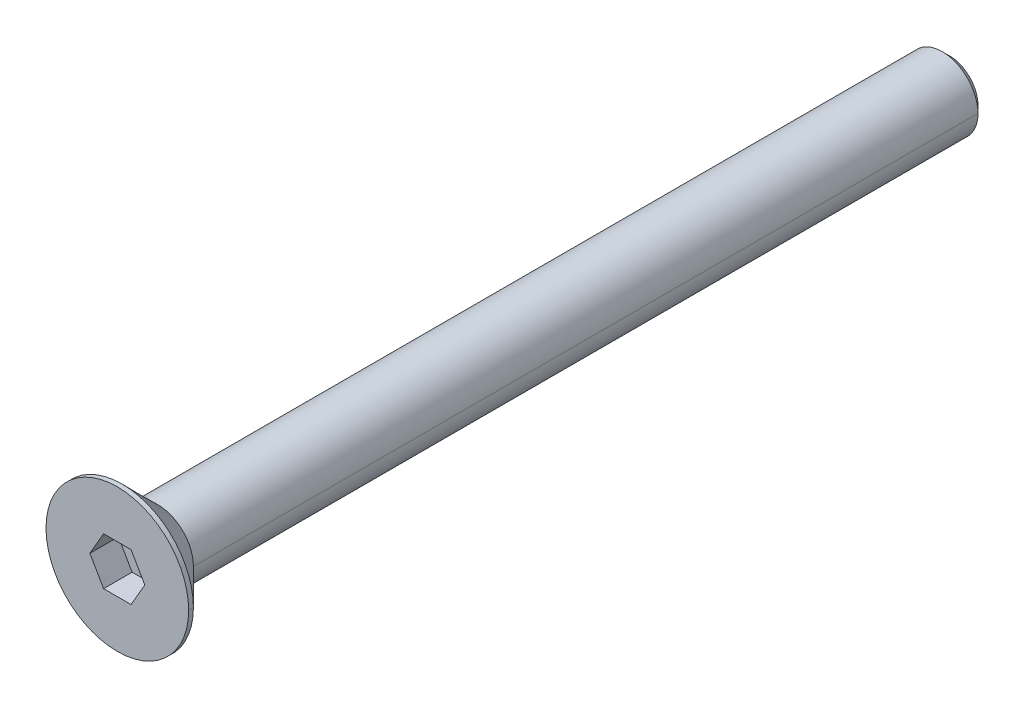
ISO-10303-21;
HEADER;
FILE_DESCRIPTION(('STEP AP214'),'2;1');
FILE_NAME('part.step','',(''),(''),'','','');
FILE_SCHEMA(('AUTOMOTIVE_DESIGN { 1 0 10303 214 1 1 1 1 }'));
ENDSEC;
DATA;
#1=APPLICATION_CONTEXT('core data for automotive mechanical design processes');
#2=APPLICATION_PROTOCOL_DEFINITION('international standard','automotive_design',2000,#1);
#3=PRODUCT_CONTEXT('',#1,'mechanical');
#4=PRODUCT('Part','Part','',(#3));
#5=PRODUCT_RELATED_PRODUCT_CATEGORY('part','',(#4));
#6=PRODUCT_DEFINITION_FORMATION('','',#4);
#7=PRODUCT_DEFINITION_CONTEXT('part definition',#1,'design');
#8=PRODUCT_DEFINITION('design','',#6,#7);
#9=PRODUCT_DEFINITION_SHAPE('','',#8);
#10=(LENGTH_UNIT() NAMED_UNIT(*) SI_UNIT(.MILLI.,.METRE.));
#11=(NAMED_UNIT(*) PLANE_ANGLE_UNIT() SI_UNIT($,.RADIAN.));
#12=(NAMED_UNIT(*) SI_UNIT($,.STERADIAN.) SOLID_ANGLE_UNIT());
#13=UNCERTAINTY_MEASURE_WITH_UNIT(LENGTH_MEASURE(1.E-05),#10,'distance_accuracy_value','');
#14=(GEOMETRIC_REPRESENTATION_CONTEXT(3) GLOBAL_UNCERTAINTY_ASSIGNED_CONTEXT((#13)) GLOBAL_UNIT_ASSIGNED_CONTEXT((#10,
#11,#12)) REPRESENTATION_CONTEXT('',''));
#15=CARTESIAN_POINT('',(0.,0.,0.));
#16=DIRECTION('',(0.,0.,1.));
#17=DIRECTION('',(1.,0.,0.));
#18=AXIS2_PLACEMENT_3D('',#15,#16,#17);
#19=CARTESIAN_POINT('',(0.,0.,1.7));
#20=DIRECTION('',(0.,0.,1.));
#21=DIRECTION('',(1.,0.,0.));
#22=AXIS2_PLACEMENT_3D('',#19,#20,#21);
#23=PLANE('',#22);
#24=DIRECTION('',(0.50000000000019,0.866025403784329,0.));
#25=VECTOR('',#24,1.);
#26=CARTESIAN_POINT('',(0.5775,-1.000259341371,1.7));
#27=LINE('',#26,#25);
#28=CARTESIAN_POINT('',(0.5775,-1.000259341371,1.7));
#29=VERTEX_POINT('',#28);
#30=CARTESIAN_POINT('',(1.155,0.,1.7));
#31=VERTEX_POINT('',#30);
#32=EDGE_CURVE('E28',#29,#31,#27,.T.);
#33=ORIENTED_EDGE('',*,*,#32,.F.);
#34=DIRECTION('',(1.,0.,0.));
#35=VECTOR('',#34,1.);
#36=CARTESIAN_POINT('',(-0.5775,-1.000259341371,1.7));
#37=LINE('',#36,#35);
#38=CARTESIAN_POINT('',(-0.5775,-1.000259341371,1.7));
#39=VERTEX_POINT('',#38);
#40=EDGE_CURVE('E163',#39,#29,#37,.T.);
#41=ORIENTED_EDGE('',*,*,#40,.F.);
#42=DIRECTION('',(0.50000000000019,-0.866025403784329,0.));
#43=VECTOR('',#42,1.);
#44=CARTESIAN_POINT('',(-1.155,0.,1.7));
#45=LINE('',#44,#43);
#46=CARTESIAN_POINT('',(-1.155,0.,1.7));
#47=VERTEX_POINT('',#46);
#48=EDGE_CURVE('E164',#47,#39,#45,.T.);
#49=ORIENTED_EDGE('',*,*,#48,.F.);
#50=DIRECTION('',(-0.50000000000019,-0.866025403784329,0.));
#51=VECTOR('',#50,1.);
#52=CARTESIAN_POINT('',(-0.5775,1.000259341371,1.7));
#53=LINE('',#52,#51);
#54=CARTESIAN_POINT('',(-0.5775,1.000259341371,1.7));
#55=VERTEX_POINT('',#54);
#56=EDGE_CURVE('E207',#55,#47,#53,.T.);
#57=ORIENTED_EDGE('',*,*,#56,.F.);
#58=DIRECTION('',(-1.,0.,0.));
#59=VECTOR('',#58,1.);
#60=CARTESIAN_POINT('',(0.5775,1.000259341371,1.7));
#61=LINE('',#60,#59);
#62=CARTESIAN_POINT('',(0.5775,1.000259341371,1.7));
#63=VERTEX_POINT('',#62);
#64=EDGE_CURVE('E187',#63,#55,#61,.T.);
#65=ORIENTED_EDGE('',*,*,#64,.F.);
#66=DIRECTION('',(-0.50000000000019,0.866025403784329,0.));
#67=VECTOR('',#66,1.);
#68=CARTESIAN_POINT('',(1.155,0.,1.7));
#69=LINE('',#68,#67);
#70=EDGE_CURVE('E188',#31,#63,#69,.T.);
#71=ORIENTED_EDGE('',*,*,#70,.F.);
#72=EDGE_LOOP('',(#33,#41,#49,#57,#65,#71));
#73=FACE_BOUND('',#72,.T.);
#74=CARTESIAN_POINT('',(0.,0.,1.7));
#75=DIRECTION('',(0.,0.,1.));
#76=DIRECTION('',(1.,0.,0.));
#77=AXIS2_PLACEMENT_3D('',#74,#75,#76);
#78=CIRCLE('',#77,3.);
#79=CARTESIAN_POINT('',(3.,0.,1.7));
#80=VERTEX_POINT('',#79);
#81=CARTESIAN_POINT('',(-3.,0.,1.7));
#82=VERTEX_POINT('',#81);
#83=EDGE_CURVE('E11',#80,#82,#78,.T.);
#84=ORIENTED_EDGE('',*,*,#83,.T.);
#85=CARTESIAN_POINT('',(0.,0.,1.7));
#86=DIRECTION('',(0.,0.,1.));
#87=DIRECTION('',(1.,0.,0.));
#88=AXIS2_PLACEMENT_3D('',#85,#86,#87);
#89=CIRCLE('',#88,3.);
#90=EDGE_CURVE('E151',#82,#80,#89,.T.);
#91=ORIENTED_EDGE('',*,*,#90,.T.);
#92=EDGE_LOOP('',(#84,#91));
#93=FACE_BOUND('',#92,.T.);
#94=ADVANCED_FACE('F17',(#73,#93),#23,.T.);
#95=CARTESIAN_POINT('',(0.,0.,1.7));
#96=DIRECTION('',(0.,0.,-1.));
#97=DIRECTION('',(1.,0.,0.));
#98=AXIS2_PLACEMENT_3D('',#95,#96,#97);
#99=CYLINDRICAL_SURFACE('',#98,3.);
#100=DIRECTION('',(0.,0.,-1.));
#101=VECTOR('',#100,1.);
#102=CARTESIAN_POINT('',(-3.,0.,1.7));
#103=LINE('',#102,#101);
#104=CARTESIAN_POINT('',(-3.,0.,1.5));
#105=VERTEX_POINT('',#104);
#106=EDGE_CURVE('E200',#82,#105,#103,.T.);
#107=ORIENTED_EDGE('',*,*,#106,.F.);
#108=ORIENTED_EDGE('',*,*,#83,.F.);
#109=DIRECTION('',(0.,0.,-1.));
#110=VECTOR('',#109,1.);
#111=CARTESIAN_POINT('',(3.,0.,1.7));
#112=LINE('',#111,#110);
#113=CARTESIAN_POINT('',(3.,0.,1.5));
#114=VERTEX_POINT('',#113);
#115=EDGE_CURVE('E21',#80,#114,#112,.T.);
#116=ORIENTED_EDGE('',*,*,#115,.T.);
#117=CARTESIAN_POINT('',(0.,0.,1.5));
#118=DIRECTION('',(0.,0.,1.));
#119=DIRECTION('',(1.,0.,0.));
#120=AXIS2_PLACEMENT_3D('',#117,#118,#119);
#121=CIRCLE('',#120,3.);
#122=EDGE_CURVE('E169',#114,#105,#121,.T.);
#123=ORIENTED_EDGE('',*,*,#122,.T.);
#124=EDGE_LOOP('',(#107,#108,#116,#123));
#125=FACE_BOUND('',#124,.T.);
#126=ADVANCED_FACE('F289',(#125),#99,.T.);
#127=CARTESIAN_POINT('',(0.5775,-1.000259341371,0.5));
#128=DIRECTION('',(-0.866025403784329,0.50000000000019,0.));
#129=DIRECTION('',(0.,0.,1.));
#130=AXIS2_PLACEMENT_3D('',#127,#128,#129);
#131=PLANE('',#130);
#132=DIRECTION('',(0.,0.,1.));
#133=VECTOR('',#132,1.);
#134=CARTESIAN_POINT('',(0.5775,-1.000259341371,0.5));
#135=LINE('',#134,#133);
#136=CARTESIAN_POINT('',(0.5775,-1.000259341371,0.5));
#137=VERTEX_POINT('',#136);
#138=EDGE_CURVE('E225',#137,#29,#135,.T.);
#139=ORIENTED_EDGE('',*,*,#138,.T.);
#140=ORIENTED_EDGE('',*,*,#32,.T.);
#141=DIRECTION('',(0.,0.,1.));
#142=VECTOR('',#141,1.);
#143=CARTESIAN_POINT('',(1.155,0.,0.5));
#144=LINE('',#143,#142);
#145=CARTESIAN_POINT('',(1.155,0.,0.5));
#146=VERTEX_POINT('',#145);
#147=EDGE_CURVE('E216',#146,#31,#144,.T.);
#148=ORIENTED_EDGE('',*,*,#147,.F.);
#149=DIRECTION('',(0.50000000000019,0.866025403784329,0.));
#150=VECTOR('',#149,1.);
#151=CARTESIAN_POINT('',(0.5775,-1.000259341371,0.5));
#152=LINE('',#151,#150);
#153=EDGE_CURVE('E233',#137,#146,#152,.T.);
#154=ORIENTED_EDGE('',*,*,#153,.F.);
#155=EDGE_LOOP('',(#139,#140,#148,#154));
#156=FACE_BOUND('',#155,.T.);
#157=ADVANCED_FACE('F287',(#156),#131,.T.);
#158=CARTESIAN_POINT('',(-0.5775,-1.000259341371,0.5));
#159=DIRECTION('',(0.,1.,0.));
#160=DIRECTION('',(1.,0.,0.));
#161=AXIS2_PLACEMENT_3D('',#158,#159,#160);
#162=PLANE('',#161);
#163=DIRECTION('',(0.,0.,1.));
#164=VECTOR('',#163,1.);
#165=CARTESIAN_POINT('',(-0.5775,-1.000259341371,0.5));
#166=LINE('',#165,#164);
#167=CARTESIAN_POINT('',(-0.5775,-1.000259341371,0.5));
#168=VERTEX_POINT('',#167);
#169=EDGE_CURVE('E159',#168,#39,#166,.T.);
#170=ORIENTED_EDGE('',*,*,#169,.T.);
#171=ORIENTED_EDGE('',*,*,#40,.T.);
#172=ORIENTED_EDGE('',*,*,#138,.F.);
#173=DIRECTION('',(1.,0.,0.));
#174=VECTOR('',#173,1.);
#175=CARTESIAN_POINT('',(-0.5775,-1.000259341371,0.5));
#176=LINE('',#175,#174);
#177=EDGE_CURVE('E229',#168,#137,#176,.T.);
#178=ORIENTED_EDGE('',*,*,#177,.F.);
#179=EDGE_LOOP('',(#170,#171,#172,#178));
#180=FACE_BOUND('',#179,.T.);
#181=ADVANCED_FACE('F259',(#180),#162,.T.);
#182=CARTESIAN_POINT('',(-1.155,0.,0.5));
#183=DIRECTION('',(0.866025403784329,0.50000000000019,0.));
#184=DIRECTION('',(0.,0.,-1.));
#185=AXIS2_PLACEMENT_3D('',#182,#183,#184);
#186=PLANE('',#185);
#187=DIRECTION('',(0.,0.,1.));
#188=VECTOR('',#187,1.);
#189=CARTESIAN_POINT('',(-1.155,0.,0.5));
#190=LINE('',#189,#188);
#191=CARTESIAN_POINT('',(-1.155,0.,0.5));
#192=VERTEX_POINT('',#191);
#193=EDGE_CURVE('E211',#192,#47,#190,.T.);
#194=ORIENTED_EDGE('',*,*,#193,.T.);
#195=ORIENTED_EDGE('',*,*,#48,.T.);
#196=ORIENTED_EDGE('',*,*,#169,.F.);
#197=DIRECTION('',(0.50000000000019,-0.866025403784329,0.));
#198=VECTOR('',#197,1.);
#199=CARTESIAN_POINT('',(-1.155,0.,0.5));
#200=LINE('',#199,#198);
#201=EDGE_CURVE('E181',#192,#168,#200,.T.);
#202=ORIENTED_EDGE('',*,*,#201,.F.);
#203=EDGE_LOOP('',(#194,#195,#196,#202));
#204=FACE_BOUND('',#203,.T.);
#205=ADVANCED_FACE('F250',(#204),#186,.T.);
#206=CARTESIAN_POINT('',(-0.5775,1.000259341371,0.5));
#207=DIRECTION('',(0.866025403784329,-0.50000000000019,0.));
#208=DIRECTION('',(0.,0.,-1.));
#209=AXIS2_PLACEMENT_3D('',#206,#207,#208);
#210=PLANE('',#209);
#211=DIRECTION('',(0.,0.,1.));
#212=VECTOR('',#211,1.);
#213=CARTESIAN_POINT('',(-0.5775,1.000259341371,0.5));
#214=LINE('',#213,#212);
#215=CARTESIAN_POINT('',(-0.5775,1.000259341371,0.5));
#216=VERTEX_POINT('',#215);
#217=EDGE_CURVE('E212',#216,#55,#214,.T.);
#218=ORIENTED_EDGE('',*,*,#217,.T.);
#219=ORIENTED_EDGE('',*,*,#56,.T.);
#220=ORIENTED_EDGE('',*,*,#193,.F.);
#221=DIRECTION('',(-0.50000000000019,-0.866025403784329,0.));
#222=VECTOR('',#221,1.);
#223=CARTESIAN_POINT('',(-0.5775,1.000259341371,0.5));
#224=LINE('',#223,#222);
#225=EDGE_CURVE('E157',#216,#192,#224,.T.);
#226=ORIENTED_EDGE('',*,*,#225,.F.);
#227=EDGE_LOOP('',(#218,#219,#220,#226));
#228=FACE_BOUND('',#227,.T.);
#229=ADVANCED_FACE('F277',(#228),#210,.T.);
#230=CARTESIAN_POINT('',(0.5775,1.000259341371,0.5));
#231=DIRECTION('',(0.,-1.,0.));
#232=DIRECTION('',(-1.,0.,0.));
#233=AXIS2_PLACEMENT_3D('',#230,#231,#232);
#234=PLANE('',#233);
#235=DIRECTION('',(0.,0.,1.));
#236=VECTOR('',#235,1.);
#237=CARTESIAN_POINT('',(0.5775,1.000259341371,0.5));
#238=LINE('',#237,#236);
#239=CARTESIAN_POINT('',(0.5775,1.000259341371,0.5));
#240=VERTEX_POINT('',#239);
#241=EDGE_CURVE('E184',#240,#63,#238,.T.);
#242=ORIENTED_EDGE('',*,*,#241,.T.);
#243=ORIENTED_EDGE('',*,*,#64,.T.);
#244=ORIENTED_EDGE('',*,*,#217,.F.);
#245=DIRECTION('',(-1.,0.,0.));
#246=VECTOR('',#245,1.);
#247=CARTESIAN_POINT('',(0.5775,1.000259341371,0.5));
#248=LINE('',#247,#246);
#249=EDGE_CURVE('E153',#240,#216,#248,.T.);
#250=ORIENTED_EDGE('',*,*,#249,.F.);
#251=EDGE_LOOP('',(#242,#243,#244,#250));
#252=FACE_BOUND('',#251,.T.);
#253=ADVANCED_FACE('F276',(#252),#234,.T.);
#254=CARTESIAN_POINT('',(1.155,0.,0.5));
#255=DIRECTION('',(-0.866025403784329,-0.50000000000019,0.));
#256=DIRECTION('',(-0.50000000000019,0.866025403784329,0.));
#257=AXIS2_PLACEMENT_3D('',#254,#255,#256);
#258=PLANE('',#257);
#259=ORIENTED_EDGE('',*,*,#147,.T.);
#260=ORIENTED_EDGE('',*,*,#70,.T.);
#261=ORIENTED_EDGE('',*,*,#241,.F.);
#262=DIRECTION('',(-0.50000000000019,0.866025403784329,0.));
#263=VECTOR('',#262,1.);
#264=CARTESIAN_POINT('',(1.155,0.,0.5));
#265=LINE('',#264,#263);
#266=EDGE_CURVE('E158',#146,#240,#265,.T.);
#267=ORIENTED_EDGE('',*,*,#266,.F.);
#268=EDGE_LOOP('',(#259,#260,#261,#267));
#269=FACE_BOUND('',#268,.T.);
#270=ADVANCED_FACE('F280',(#269),#258,.T.);
#271=CARTESIAN_POINT('',(0.,0.,1.5));
#272=DIRECTION('',(0.,0.,1.));
#273=DIRECTION('',(1.,0.,0.));
#274=AXIS2_PLACEMENT_3D('',#271,#272,#273);
#275=CONICAL_SURFACE('',#274,3.,0.785398163397001);
#276=DIRECTION('',(-0.707106781186231,0.,0.707106781186864));
#277=VECTOR('',#276,1.);
#278=CARTESIAN_POINT('',(-3.,0.,1.5));
#279=LINE('',#278,#277);
#280=CARTESIAN_POINT('',(-1.5,0.,0.));
#281=VERTEX_POINT('',#280);
#282=EDGE_CURVE('E165',#281,#105,#279,.T.);
#283=ORIENTED_EDGE('',*,*,#282,.F.);
#284=CARTESIAN_POINT('',(0.,0.,0.));
#285=DIRECTION('',(0.,0.,1.));
#286=DIRECTION('',(1.,0.,0.));
#287=AXIS2_PLACEMENT_3D('',#284,#285,#286);
#288=CIRCLE('',#287,1.5);
#289=CARTESIAN_POINT('',(1.5,0.,0.));
#290=VERTEX_POINT('',#289);
#291=EDGE_CURVE('E190',#281,#290,#288,.T.);
#292=ORIENTED_EDGE('',*,*,#291,.T.);
#293=DIRECTION('',(0.707106781186231,0.,0.707106781186864));
#294=VECTOR('',#293,1.);
#295=CARTESIAN_POINT('',(3.,0.,1.5));
#296=LINE('',#295,#294);
#297=EDGE_CURVE('E177',#290,#114,#296,.T.);
#298=ORIENTED_EDGE('',*,*,#297,.T.);
#299=CARTESIAN_POINT('',(0.,0.,1.5));
#300=DIRECTION('',(0.,0.,1.));
#301=DIRECTION('',(1.,0.,0.));
#302=AXIS2_PLACEMENT_3D('',#299,#300,#301);
#303=CIRCLE('',#302,3.);
#304=EDGE_CURVE('E196',#105,#114,#303,.T.);
#305=ORIENTED_EDGE('',*,*,#304,.F.);
#306=EDGE_LOOP('',(#283,#292,#298,#305));
#307=FACE_BOUND('',#306,.T.);
#308=ADVANCED_FACE('F327',(#307),#275,.T.);
#309=CARTESIAN_POINT('',(0.,0.,0.5));
#310=DIRECTION('',(0.,0.,1.));
#311=DIRECTION('',(1.,0.,0.));
#312=AXIS2_PLACEMENT_3D('',#309,#310,#311);
#313=PLANE('',#312);
#314=ORIENTED_EDGE('',*,*,#266,.T.);
#315=ORIENTED_EDGE('',*,*,#249,.T.);
#316=ORIENTED_EDGE('',*,*,#225,.T.);
#317=ORIENTED_EDGE('',*,*,#201,.T.);
#318=ORIENTED_EDGE('',*,*,#177,.T.);
#319=ORIENTED_EDGE('',*,*,#153,.T.);
#320=EDGE_LOOP('',(#314,#315,#316,#317,#318,#319));
#321=FACE_BOUND('',#320,.T.);
#322=ADVANCED_FACE('F262',(#321),#313,.T.);
#323=CARTESIAN_POINT('',(0.,0.,-33.));
#324=DIRECTION('',(0.,0.,1.));
#325=DIRECTION('',(1.,0.,0.));
#326=AXIS2_PLACEMENT_3D('',#323,#324,#325);
#327=CYLINDRICAL_SURFACE('',#326,1.5);
#328=DIRECTION('',(0.,0.,1.));
#329=VECTOR('',#328,1.);
#330=CARTESIAN_POINT('',(-1.5,0.,-33.));
#331=LINE('',#330,#329);
#332=CARTESIAN_POINT('',(-1.49999999999973,0.,-33.));
#333=VERTEX_POINT('',#332);
#334=EDGE_CURVE('E147',#333,#281,#331,.T.);
#335=ORIENTED_EDGE('',*,*,#334,.F.);
#336=CARTESIAN_POINT('',(0.,0.,-33.));
#337=DIRECTION('',(0.,0.,1.));
#338=DIRECTION('',(1.,0.,0.));
#339=AXIS2_PLACEMENT_3D('',#336,#337,#338);
#340=CIRCLE('',#339,1.5);
#341=CARTESIAN_POINT('',(1.49999999999973,0.,-33.));
#342=VERTEX_POINT('',#341);
#343=EDGE_CURVE('E129',#333,#342,#340,.T.);
#344=ORIENTED_EDGE('',*,*,#343,.T.);
#345=DIRECTION('',(0.,0.,1.));
#346=VECTOR('',#345,1.);
#347=CARTESIAN_POINT('',(1.5,0.,-33.));
#348=LINE('',#347,#346);
#349=EDGE_CURVE('E141',#342,#290,#348,.T.);
#350=ORIENTED_EDGE('',*,*,#349,.T.);
#351=ORIENTED_EDGE('',*,*,#291,.F.);
#352=EDGE_LOOP('',(#335,#344,#350,#351));
#353=FACE_BOUND('',#352,.T.);
#354=ADVANCED_FACE('F322',(#353),#327,.T.);
#355=CARTESIAN_POINT('',(0.,0.,-33.3));
#356=DIRECTION('',(0.,0.,1.));
#357=DIRECTION('',(1.,0.,0.));
#358=AXIS2_PLACEMENT_3D('',#355,#356,#357);
#359=CONICAL_SURFACE('',#358,1.2,0.785398163397001);
#360=DIRECTION('',(-0.707106781186231,0.,0.707106781186864));
#361=VECTOR('',#360,1.);
#362=CARTESIAN_POINT('',(-1.2,0.,-33.3));
#363=LINE('',#362,#361);
#364=CARTESIAN_POINT('',(-1.2,0.,-33.3));
#365=VERTEX_POINT('',#364);
#366=EDGE_CURVE('E133',#365,#333,#363,.T.);
#367=ORIENTED_EDGE('',*,*,#366,.F.);
#368=CARTESIAN_POINT('',(0.,0.,-33.3));
#369=DIRECTION('',(0.,0.,1.));
#370=DIRECTION('',(1.,0.,0.));
#371=AXIS2_PLACEMENT_3D('',#368,#369,#370);
#372=CIRCLE('',#371,1.2);
#373=CARTESIAN_POINT('',(1.2,0.,-33.3));
#374=VERTEX_POINT('',#373);
#375=EDGE_CURVE('E120',#365,#374,#372,.T.);
#376=ORIENTED_EDGE('',*,*,#375,.T.);
#377=DIRECTION('',(0.707106781186231,0.,0.707106781186864));
#378=VECTOR('',#377,1.);
#379=CARTESIAN_POINT('',(1.2,0.,-33.3));
#380=LINE('',#379,#378);
#381=EDGE_CURVE('E130',#374,#342,#380,.T.);
#382=ORIENTED_EDGE('',*,*,#381,.T.);
#383=ORIENTED_EDGE('',*,*,#343,.F.);
#384=EDGE_LOOP('',(#367,#376,#382,#383));
#385=FACE_BOUND('',#384,.T.);
#386=ADVANCED_FACE('F134',(#385),#359,.T.);
#387=CARTESIAN_POINT('',(0.,0.,-33.3));
#388=DIRECTION('',(0.,0.,1.));
#389=DIRECTION('',(1.,0.,0.));
#390=AXIS2_PLACEMENT_3D('',#387,#388,#389);
#391=PLANE('',#390);
#392=CARTESIAN_POINT('',(0.,0.,-33.3));
#393=DIRECTION('',(0.,0.,1.));
#394=DIRECTION('',(1.,0.,0.));
#395=AXIS2_PLACEMENT_3D('',#392,#393,#394);
#396=CIRCLE('',#395,1.2);
#397=EDGE_CURVE('E124',#374,#365,#396,.T.);
#398=ORIENTED_EDGE('',*,*,#397,.F.);
#399=ORIENTED_EDGE('',*,*,#375,.F.);
#400=EDGE_LOOP('',(#398,#399));
#401=FACE_BOUND('',#400,.T.);
#402=ADVANCED_FACE('F122',(#401),#391,.F.);
#403=CARTESIAN_POINT('',(0.,0.,-33.3));
#404=DIRECTION('',(0.,0.,1.));
#405=DIRECTION('',(1.,0.,0.));
#406=AXIS2_PLACEMENT_3D('',#403,#404,#405);
#407=CONICAL_SURFACE('',#406,1.2,0.785398163397001);
#408=ORIENTED_EDGE('',*,*,#397,.T.);
#409=ORIENTED_EDGE('',*,*,#366,.T.);
#410=CARTESIAN_POINT('',(0.,0.,-33.));
#411=DIRECTION('',(0.,0.,1.));
#412=DIRECTION('',(1.,0.,0.));
#413=AXIS2_PLACEMENT_3D('',#410,#411,#412);
#414=CIRCLE('',#413,1.5);
#415=EDGE_CURVE('E174',#342,#333,#414,.T.);
#416=ORIENTED_EDGE('',*,*,#415,.F.);
#417=ORIENTED_EDGE('',*,*,#381,.F.);
#418=EDGE_LOOP('',(#408,#409,#416,#417));
#419=FACE_BOUND('',#418,.T.);
#420=ADVANCED_FACE('F19',(#419),#407,.T.);
#421=CARTESIAN_POINT('',(0.,0.,-33.));
#422=DIRECTION('',(0.,0.,1.));
#423=DIRECTION('',(1.,0.,0.));
#424=AXIS2_PLACEMENT_3D('',#421,#422,#423);
#425=CYLINDRICAL_SURFACE('',#424,1.5);
#426=ORIENTED_EDGE('',*,*,#415,.T.);
#427=ORIENTED_EDGE('',*,*,#334,.T.);
#428=CARTESIAN_POINT('',(0.,0.,0.));
#429=DIRECTION('',(0.,0.,1.));
#430=DIRECTION('',(1.,0.,0.));
#431=AXIS2_PLACEMENT_3D('',#428,#429,#430);
#432=CIRCLE('',#431,1.5);
#433=EDGE_CURVE('E170',#290,#281,#432,.T.);
#434=ORIENTED_EDGE('',*,*,#433,.F.);
#435=ORIENTED_EDGE('',*,*,#349,.F.);
#436=EDGE_LOOP('',(#426,#427,#434,#435));
#437=FACE_BOUND('',#436,.T.);
#438=ADVANCED_FACE('F306',(#437),#425,.T.);
#439=CARTESIAN_POINT('',(0.,0.,1.5));
#440=DIRECTION('',(0.,0.,1.));
#441=DIRECTION('',(1.,0.,0.));
#442=AXIS2_PLACEMENT_3D('',#439,#440,#441);
#443=CONICAL_SURFACE('',#442,3.,0.785398163397001);
#444=ORIENTED_EDGE('',*,*,#433,.T.);
#445=ORIENTED_EDGE('',*,*,#282,.T.);
#446=ORIENTED_EDGE('',*,*,#122,.F.);
#447=ORIENTED_EDGE('',*,*,#297,.F.);
#448=EDGE_LOOP('',(#444,#445,#446,#447));
#449=FACE_BOUND('',#448,.T.);
#450=ADVANCED_FACE('F308',(#449),#443,.T.);
#451=CARTESIAN_POINT('',(0.,0.,1.7));
#452=DIRECTION('',(0.,0.,-1.));
#453=DIRECTION('',(1.,0.,0.));
#454=AXIS2_PLACEMENT_3D('',#451,#452,#453);
#455=CYLINDRICAL_SURFACE('',#454,3.);
#456=ORIENTED_EDGE('',*,*,#90,.F.);
#457=ORIENTED_EDGE('',*,*,#106,.T.);
#458=ORIENTED_EDGE('',*,*,#304,.T.);
#459=ORIENTED_EDGE('',*,*,#115,.F.);
#460=EDGE_LOOP('',(#456,#457,#458,#459));
#461=FACE_BOUND('',#460,.T.);
#462=ADVANCED_FACE('F314',(#461),#455,.T.);
#463=CLOSED_SHELL('',(#94,#126,#157,#181,#205,#229,#253,#270,#308,#322,#354,#386,#402,#420,#438,
#450,#462));
#464=MANIFOLD_SOLID_BREP('B1',#463);
#465=ADVANCED_BREP_SHAPE_REPRESENTATION('',(#18,#464),#14);
#466=SHAPE_DEFINITION_REPRESENTATION(#9,#465);
ENDSEC;
END-ISO-10303-21;
